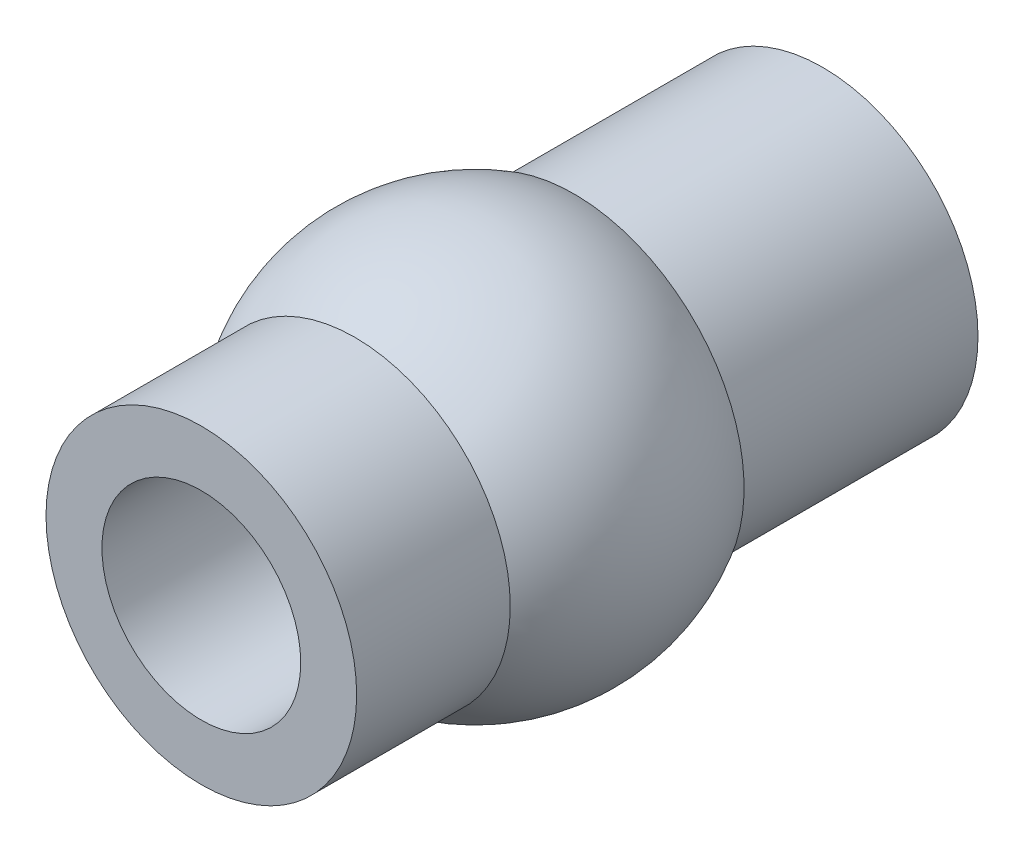
ISO-10303-21;
HEADER;
FILE_DESCRIPTION(('STEP AP214'),'2;1');
FILE_NAME('part.step','',(''),(''),'','','');
FILE_SCHEMA(('AUTOMOTIVE_DESIGN { 1 0 10303 214 1 1 1 1 }'));
ENDSEC;
DATA;
#1=APPLICATION_CONTEXT('core data for automotive mechanical design processes');
#2=APPLICATION_PROTOCOL_DEFINITION('international standard','automotive_design',2000,#1);
#3=PRODUCT_CONTEXT('',#1,'mechanical');
#4=PRODUCT('Part','Part','',(#3));
#5=PRODUCT_RELATED_PRODUCT_CATEGORY('part','',(#4));
#6=PRODUCT_DEFINITION_FORMATION('','',#4);
#7=PRODUCT_DEFINITION_CONTEXT('part definition',#1,'design');
#8=PRODUCT_DEFINITION('design','',#6,#7);
#9=PRODUCT_DEFINITION_SHAPE('','',#8);
#10=(LENGTH_UNIT() NAMED_UNIT(*) SI_UNIT(.MILLI.,.METRE.));
#11=(NAMED_UNIT(*) PLANE_ANGLE_UNIT() SI_UNIT($,.RADIAN.));
#12=(NAMED_UNIT(*) SI_UNIT($,.STERADIAN.) SOLID_ANGLE_UNIT());
#13=UNCERTAINTY_MEASURE_WITH_UNIT(LENGTH_MEASURE(1.E-05),#10,'distance_accuracy_value','');
#14=(GEOMETRIC_REPRESENTATION_CONTEXT(3) GLOBAL_UNCERTAINTY_ASSIGNED_CONTEXT((#13)) GLOBAL_UNIT_ASSIGNED_CONTEXT((#10,
#11,#12)) REPRESENTATION_CONTEXT('',''));
#15=CARTESIAN_POINT('',(0.,0.,0.));
#16=DIRECTION('',(0.,0.,1.));
#17=DIRECTION('',(1.,0.,0.));
#18=AXIS2_PLACEMENT_3D('',#15,#16,#17);
#19=CARTESIAN_POINT('',(0.,0.,10.));
#20=DIRECTION('',(0.,0.,-1.));
#21=DIRECTION('',(-1.,0.,0.));
#22=AXIS2_PLACEMENT_3D('',#19,#20,#21);
#23=CYLINDRICAL_SURFACE('',#22,2.5);
#24=CARTESIAN_POINT('',(0.,0.,0.));
#25=DIRECTION('',(0.,0.,1.));
#26=DIRECTION('',(1.,0.,0.));
#27=AXIS2_PLACEMENT_3D('',#24,#25,#26);
#28=CIRCLE('',#27,2.5);
#29=CARTESIAN_POINT('',(2.5,0.,0.));
#30=VERTEX_POINT('',#29);
#31=EDGE_CURVE('E46',#30,#30,#28,.T.);
#32=ORIENTED_EDGE('',*,*,#31,.T.);
#33=EDGE_LOOP('',(#32));
#34=FACE_BOUND('',#33,.T.);
#35=CARTESIAN_POINT('',(0.,0.,4.));
#36=DIRECTION('',(0.,0.,1.));
#37=DIRECTION('',(1.,0.,0.));
#38=AXIS2_PLACEMENT_3D('',#35,#36,#37);
#39=CIRCLE('',#38,2.5);
#40=CARTESIAN_POINT('',(2.5,0.,4.));
#41=VERTEX_POINT('',#40);
#42=EDGE_CURVE('E10',#41,#41,#39,.T.);
#43=ORIENTED_EDGE('',*,*,#42,.F.);
#44=EDGE_LOOP('',(#43));
#45=FACE_BOUND('',#44,.T.);
#46=ADVANCED_FACE('F32',(#34,#45),#23,.T.);
#47=CARTESIAN_POINT('',(0.,0.,0.));
#48=DIRECTION('',(0.,0.,1.));
#49=DIRECTION('',(1.,0.,0.));
#50=AXIS2_PLACEMENT_3D('',#47,#48,#49);
#51=PLANE('',#50);
#52=CARTESIAN_POINT('',(0.,0.,0.));
#53=DIRECTION('',(0.,0.,1.));
#54=DIRECTION('',(1.,0.,0.));
#55=AXIS2_PLACEMENT_3D('',#52,#53,#54);
#56=CIRCLE('',#55,1.6);
#57=CARTESIAN_POINT('',(1.6,0.,0.));
#58=VERTEX_POINT('',#57);
#59=EDGE_CURVE('E54',#58,#58,#56,.T.);
#60=ORIENTED_EDGE('',*,*,#59,.T.);
#61=EDGE_LOOP('',(#60));
#62=FACE_BOUND('',#61,.T.);
#63=ORIENTED_EDGE('',*,*,#31,.F.);
#64=EDGE_LOOP('',(#63));
#65=FACE_BOUND('',#64,.T.);
#66=ADVANCED_FACE('F61',(#62,#65),#51,.F.);
#67=CARTESIAN_POINT('',(0.,0.,5.58973575424211));
#68=DIRECTION('',(0.,0.,1.));
#69=DIRECTION('',(-1.,0.,0.));
#70=AXIS2_PLACEMENT_3D('',#67,#68,#69);
#71=SPHERICAL_SURFACE('',#70,3.16348612841128);
#72=CARTESIAN_POINT('',(0.,0.,4.));
#73=DIRECTION('',(0.,0.,1.));
#74=DIRECTION('',(1.,0.,0.));
#75=AXIS2_PLACEMENT_3D('',#72,#73,#74);
#76=CIRCLE('',#75,2.73502919844284);
#77=CARTESIAN_POINT('',(-2.73502919844284,0.,4.));
#78=VERTEX_POINT('',#77);
#79=EDGE_CURVE('E50',#78,#78,#76,.T.);
#80=CARTESIAN_POINT('',(0.,0.,7.52820021990832));
#81=DIRECTION('',(0.,0.,-1.));
#82=DIRECTION('',(-1.,0.,0.));
#83=AXIS2_PLACEMENT_3D('',#80,#81,#82);
#84=CIRCLE('',#83,2.5);
#85=CARTESIAN_POINT('',(-2.5,0.,7.52820021990832));
#86=VERTEX_POINT('',#85);
#87=EDGE_CURVE('E38',#86,#86,#84,.T.);
#88=CARTESIAN_POINT('',(-2.73502919844284,0.,4.));
#89=CARTESIAN_POINT('',(-2.75467052813002,0.,4.03379082363754));
#90=CARTESIAN_POINT('',(-2.77368501373238,0.,4.06794597387812));
#91=CARTESIAN_POINT('',(-2.8104355628201,0.,4.13693727316121));
#92=CARTESIAN_POINT('',(-2.82817162630546,0.,4.17177342220372));
#93=CARTESIAN_POINT('',(-2.86234059721183,0.,4.24207906468647));
#94=CARTESIAN_POINT('',(-2.87877350463284,0.,4.27754855812672));
#95=CARTESIAN_POINT('',(-2.91031369006242,0.,4.34907211436693));
#96=CARTESIAN_POINT('',(-2.92542096807099,0.,4.38512617716688));
#97=CARTESIAN_POINT('',(-2.95428911617492,0.,4.45776936126642));
#98=CARTESIAN_POINT('',(-2.96804998627028,0.,4.49435848256599));
#99=CARTESIAN_POINT('',(-2.99420642330078,0.,4.56802151983467));
#100=CARTESIAN_POINT('',(-3.00660199023593,0.,4.60509543580378));
#101=CARTESIAN_POINT('',(-3.03001079207236,0.,4.67967713747345));
#102=CARTESIAN_POINT('',(-3.04102402697365,0.,4.71718492317401));
#103=CARTESIAN_POINT('',(-3.06165303711124,0.,4.79258284209866));
#104=CARTESIAN_POINT('',(-3.07126881234755,0.,4.83047297532274));
#105=CARTESIAN_POINT('',(-3.08908969447097,0.,4.90658354222749));
#106=CARTESIAN_POINT('',(-3.09729480135808,0.,4.94480397590816));
#107=CARTESIAN_POINT('',(-3.11228307601373,0.,5.02152264285474));
#108=CARTESIAN_POINT('',(-3.11906624378227,0.,5.06002087612065));
#109=CARTESIAN_POINT('',(-3.13120132260732,0.,5.13724225979655));
#110=CARTESIAN_POINT('',(-3.13655323366384,0.,5.17596541020654));
#111=CARTESIAN_POINT('',(-3.14581844750548,0.,5.25358343676913));
#112=CARTESIAN_POINT('',(-3.1497317502906,0.,5.29247831292172));
#113=CARTESIAN_POINT('',(-3.15611437214661,0.,5.37038636368169));
#114=CARTESIAN_POINT('',(-3.1585836912175,0.,5.40939953828907));
#115=CARTESIAN_POINT('',(-3.16207495370689,0.,5.4874905961716));
#116=CARTESIAN_POINT('',(-3.16309689712539,0.,5.52656847944676));
#117=CARTESIAN_POINT('',(-3.16369200453467,0.,5.60473527599204));
#118=CARTESIAN_POINT('',(-3.16326516852546,0.,5.64382418926216));
#119=CARTESIAN_POINT('',(-3.1609633033954,0.,5.72195935197335));
#120=CARTESIAN_POINT('',(-3.15908827427454,0.,5.76100560141442));
#121=CARTESIAN_POINT('',(-3.1538925985232,0.,5.83900180124792));
#122=CARTESIAN_POINT('',(-3.15057195189271,0.,5.87795175164036));
#123=CARTESIAN_POINT('',(-3.14248960247214,0.,5.9557018504366));
#124=CARTESIAN_POINT('',(-3.13772789968205,0.,5.9945019988404));
#125=CARTESIAN_POINT('',(-3.1267699787747,0.,6.07189919649231));
#126=CARTESIAN_POINT('',(-3.12057376065744,0.,6.11049624574042));
#127=CARTESIAN_POINT('',(-3.1067553204259,0.,6.18743422689764));
#128=CARTESIAN_POINT('',(-3.09913309831163,0.,6.22577515880677));
#129=CARTESIAN_POINT('',(-3.08247312022229,0.,6.30214823891381));
#130=CARTESIAN_POINT('',(-3.07343536424722,0.,6.34018038711174));
#131=CARTESIAN_POINT('',(-3.05395673299743,0.,6.4158836575803));
#132=CARTESIAN_POINT('',(-3.04351585772271,0.,6.45355477985094));
#133=CARTESIAN_POINT('',(-3.02124532980277,0.,6.52848425216376));
#134=CARTESIAN_POINT('',(-3.00941567715756,0.,6.56574260220595));
#135=CARTESIAN_POINT('',(-2.9843838441078,0.,6.63979535076657));
#136=CARTESIAN_POINT('',(-2.97118166370327,0.,6.676589749285));
#137=CARTESIAN_POINT('',(-2.94342291005262,0.,6.74966405277113));
#138=CARTESIAN_POINT('',(-2.92886633680652,0.,6.78594395773882));
#139=CARTESIAN_POINT('',(-2.89841879298959,0.,6.85793943893689));
#140=CARTESIAN_POINT('',(-2.88252782241877,0.,6.89365501516726));
#141=CARTESIAN_POINT('',(-2.8494333118433,0.,6.96447277845537));
#142=CARTESIAN_POINT('',(-2.83222977183865,0.,6.99957496551311));
#143=CARTESIAN_POINT('',(-2.79653375550793,0.,7.06911773419466));
#144=CARTESIAN_POINT('',(-2.77804127918186,0.,7.10355831581846));
#145=CARTESIAN_POINT('',(-2.73979278551361,0.,7.17173056019386));
#146=CARTESIAN_POINT('',(-2.72003676817143,0.,7.20546222294545));
#147=CARTESIAN_POINT('',(-2.67928835451585,0.,7.27217031225051));
#148=CARTESIAN_POINT('',(-2.65829595820245,0.,7.30514673880398));
#149=CARTESIAN_POINT('',(-2.61510353092165,0.,7.37029899251255));
#150=CARTESIAN_POINT('',(-2.59290349995425,0.,7.40247481966765));
#151=CARTESIAN_POINT('',(-2.54732663966654,0.,7.46598192195812));
#152=CARTESIAN_POINT('',(-2.52394981034623,0.,7.49731319709349));
#153=CARTESIAN_POINT('',(-2.5,0.,7.52820021990832));
#154=B_SPLINE_CURVE_WITH_KNOTS('',3,(#88,#89,#90,#91,#92,#93,#94,#95,#96,#97,#98,#99,#100,#101,
#102,#103,#104,#105,#106,#107,#108,#109,#110,#111,#112,#113,#114,#115,#116,#117,#118,#119,#120,
#121,#122,#123,#124,#125,#126,#127,#128,#129,#130,#131,#132,#133,#134,#135,#136,#137,#138,#139,
#140,#141,#142,#143,#144,#145,#146,#147,#148,#149,#150,#151,#152,#153),.UNSPECIFIED.,.F.,.F.,(4,
2,2,2,2,2,2,2,2,2,2,2,2,2,2,2,2,2,2,2,2,2,2,2,2,2,2,2,2,2,2,2,4),(0.,0.117246882418815,
0.23449376483763,0.351740647256445,0.46898752967526,0.586234412094075,0.70348129451289,
0.820728176931705,0.93797505935052,1.05522194176933,1.17246882418815,1.28971570660696,
1.40696258902578,1.52420947144459,1.64145635386341,1.75870323628223,1.87595011870104,
1.99319700111985,2.11044388353867,2.22769076595748,2.3449376483763,2.46218453079511,
2.57943141321393,2.69667829563275,2.81392517805156,2.93117206047038,3.04841894288919,
3.16566582530801,3.28291270772682,3.40015959014563,3.51740647256445,3.63465335498327,
3.75190023740208),.UNSPECIFIED.);
#155=EDGE_CURVE('BSEAM87',#78,#86,#154,.T.);
#156=ORIENTED_EDGE('',*,*,#79,.T.);
#157=ORIENTED_EDGE('',*,*,#87,.T.);
#158=ORIENTED_EDGE('',*,*,#155,.T.);
#159=ORIENTED_EDGE('',*,*,#155,.F.);
#160=EDGE_LOOP('',(#156,#158,#157,#159));
#161=FACE_BOUND('',#160,.T.);
#162=ADVANCED_FACE('F87',(#161),#71,.T.);
#163=CARTESIAN_POINT('',(0.,0.,4.));
#164=DIRECTION('',(0.,0.,1.));
#165=DIRECTION('',(1.,0.,0.));
#166=AXIS2_PLACEMENT_3D('',#163,#164,#165);
#167=PLANE('',#166);
#168=ORIENTED_EDGE('',*,*,#42,.T.);
#169=EDGE_LOOP('',(#168));
#170=FACE_BOUND('',#169,.T.);
#171=ORIENTED_EDGE('',*,*,#79,.F.);
#172=EDGE_LOOP('',(#171));
#173=FACE_BOUND('',#172,.T.);
#174=ADVANCED_FACE('F74',(#170,#173),#167,.F.);
#175=CARTESIAN_POINT('',(0.,0.,10.));
#176=DIRECTION('',(0.,0.,1.));
#177=DIRECTION('',(1.,0.,0.));
#178=AXIS2_PLACEMENT_3D('',#175,#176,#177);
#179=PLANE('',#178);
#180=CARTESIAN_POINT('',(0.,0.,10.));
#181=DIRECTION('',(0.,0.,1.));
#182=DIRECTION('',(1.,0.,0.));
#183=AXIS2_PLACEMENT_3D('',#180,#181,#182);
#184=CIRCLE('',#183,1.6);
#185=CARTESIAN_POINT('',(1.6,0.,10.));
#186=VERTEX_POINT('',#185);
#187=EDGE_CURVE('E55',#186,#186,#184,.T.);
#188=ORIENTED_EDGE('',*,*,#187,.F.);
#189=EDGE_LOOP('',(#188));
#190=FACE_BOUND('',#189,.T.);
#191=CARTESIAN_POINT('',(0.,0.,10.));
#192=DIRECTION('',(0.,0.,1.));
#193=DIRECTION('',(1.,0.,0.));
#194=AXIS2_PLACEMENT_3D('',#191,#192,#193);
#195=CIRCLE('',#194,2.5);
#196=CARTESIAN_POINT('',(2.5,0.,10.));
#197=VERTEX_POINT('',#196);
#198=EDGE_CURVE('E42',#197,#197,#195,.T.);
#199=ORIENTED_EDGE('',*,*,#198,.T.);
#200=EDGE_LOOP('',(#199));
#201=FACE_BOUND('',#200,.T.);
#202=ADVANCED_FACE('F71',(#190,#201),#179,.T.);
#203=ORIENTED_EDGE('',*,*,#198,.F.);
#204=EDGE_LOOP('',(#203));
#205=FACE_BOUND('',#204,.T.);
#206=ORIENTED_EDGE('',*,*,#87,.F.);
#207=EDGE_LOOP('',(#206));
#208=FACE_BOUND('',#207,.T.);
#209=ADVANCED_FACE('F67',(#205,#208),#23,.T.);
#210=CARTESIAN_POINT('',(0.,0.,0.));
#211=DIRECTION('',(0.,0.,1.));
#212=DIRECTION('',(1.,0.,0.));
#213=AXIS2_PLACEMENT_3D('',#210,#211,#212);
#214=CYLINDRICAL_SURFACE('',#213,1.6);
#215=ORIENTED_EDGE('',*,*,#59,.F.);
#216=EDGE_LOOP('',(#215));
#217=FACE_BOUND('',#216,.T.);
#218=ORIENTED_EDGE('',*,*,#187,.T.);
#219=EDGE_LOOP('',(#218));
#220=FACE_BOUND('',#219,.T.);
#221=ADVANCED_FACE('F64',(#217,#220),#214,.F.);
#222=CLOSED_SHELL('',(#46,#66,#162,#174,#202,#209,#221));
#223=MANIFOLD_SOLID_BREP('B2',#222);
#224=ADVANCED_BREP_SHAPE_REPRESENTATION('',(#18,#223),#14);
#225=SHAPE_DEFINITION_REPRESENTATION(#9,#224);
ENDSEC;
END-ISO-10303-21;
